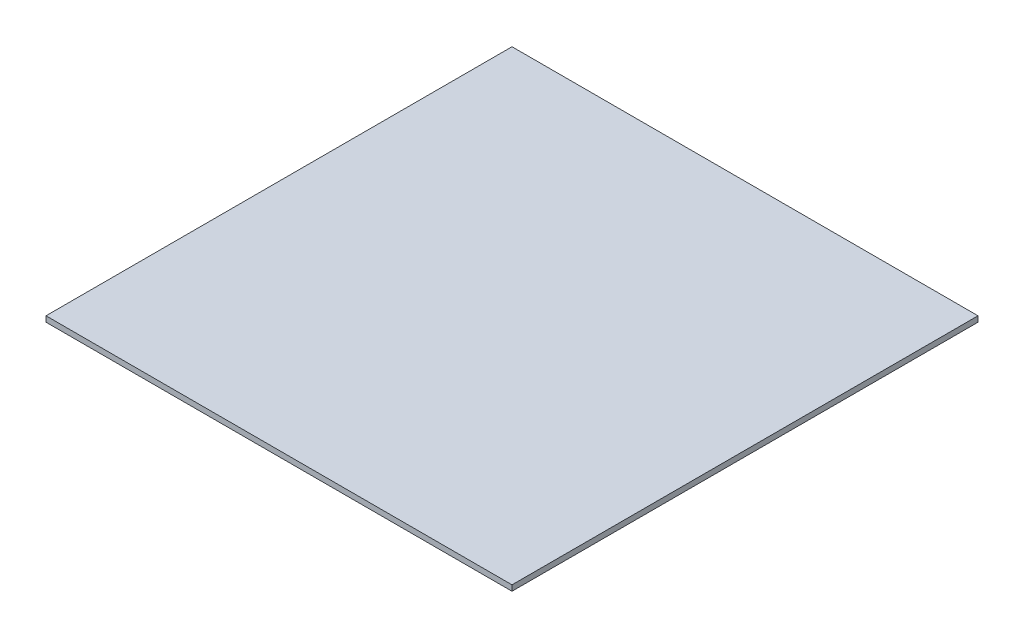
ISO-10303-21;
HEADER;
FILE_DESCRIPTION(('STEP AP214'),'2;1');
FILE_NAME('part.step','',(''),(''),'','','');
FILE_SCHEMA(('AUTOMOTIVE_DESIGN { 1 0 10303 214 1 1 1 1 }'));
ENDSEC;
DATA;
#1=APPLICATION_CONTEXT('core data for automotive mechanical design processes');
#2=APPLICATION_PROTOCOL_DEFINITION('international standard','automotive_design',2000,#1);
#3=PRODUCT_CONTEXT('',#1,'mechanical');
#4=PRODUCT('Part','Part','',(#3));
#5=PRODUCT_RELATED_PRODUCT_CATEGORY('part','',(#4));
#6=PRODUCT_DEFINITION_FORMATION('','',#4);
#7=PRODUCT_DEFINITION_CONTEXT('part definition',#1,'design');
#8=PRODUCT_DEFINITION('design','',#6,#7);
#9=PRODUCT_DEFINITION_SHAPE('','',#8);
#10=(LENGTH_UNIT() NAMED_UNIT(*) SI_UNIT(.MILLI.,.METRE.));
#11=(NAMED_UNIT(*) PLANE_ANGLE_UNIT() SI_UNIT($,.RADIAN.));
#12=(NAMED_UNIT(*) SI_UNIT($,.STERADIAN.) SOLID_ANGLE_UNIT());
#13=UNCERTAINTY_MEASURE_WITH_UNIT(LENGTH_MEASURE(1.E-05),#10,'distance_accuracy_value','');
#14=(GEOMETRIC_REPRESENTATION_CONTEXT(3) GLOBAL_UNCERTAINTY_ASSIGNED_CONTEXT((#13)) GLOBAL_UNIT_ASSIGNED_CONTEXT((#10,
#11,#12)) REPRESENTATION_CONTEXT('',''));
#15=CARTESIAN_POINT('',(0.,0.,0.));
#16=DIRECTION('',(0.,0.,1.));
#17=DIRECTION('',(1.,0.,0.));
#18=AXIS2_PLACEMENT_3D('',#15,#16,#17);
#19=CARTESIAN_POINT('',(125.,1.5,125.));
#20=DIRECTION('',(-1.,0.,0.));
#21=DIRECTION('',(0.,0.,1.));
#22=AXIS2_PLACEMENT_3D('',#19,#20,#21);
#23=PLANE('',#22);
#24=DIRECTION('',(0.,0.,-1.));
#25=VECTOR('',#24,1.);
#26=CARTESIAN_POINT('',(125.,-1.5,125.));
#27=LINE('',#26,#25);
#28=CARTESIAN_POINT('',(125.,-1.5,125.));
#29=VERTEX_POINT('',#28);
#30=CARTESIAN_POINT('',(125.,-1.5,-125.));
#31=VERTEX_POINT('',#30);
#32=EDGE_CURVE('E107',#29,#31,#27,.T.);
#33=ORIENTED_EDGE('',*,*,#32,.T.);
#34=DIRECTION('',(0.,-1.,0.));
#35=VECTOR('',#34,1.);
#36=CARTESIAN_POINT('',(125.,1.5,-125.));
#37=LINE('',#36,#35);
#38=CARTESIAN_POINT('',(125.,1.5,-125.));
#39=VERTEX_POINT('',#38);
#40=EDGE_CURVE('E11',#39,#31,#37,.T.);
#41=ORIENTED_EDGE('',*,*,#40,.F.);
#42=DIRECTION('',(0.,0.,-1.));
#43=VECTOR('',#42,1.);
#44=CARTESIAN_POINT('',(125.,1.5,125.));
#45=LINE('',#44,#43);
#46=CARTESIAN_POINT('',(125.,1.5,125.));
#47=VERTEX_POINT('',#46);
#48=EDGE_CURVE('E91',#47,#39,#45,.T.);
#49=ORIENTED_EDGE('',*,*,#48,.F.);
#50=DIRECTION('',(0.,-1.,0.));
#51=VECTOR('',#50,1.);
#52=CARTESIAN_POINT('',(125.,1.5,125.));
#53=LINE('',#52,#51);
#54=EDGE_CURVE('E103',#47,#29,#53,.T.);
#55=ORIENTED_EDGE('',*,*,#54,.T.);
#56=EDGE_LOOP('',(#33,#41,#49,#55));
#57=FACE_BOUND('',#56,.T.);
#58=ADVANCED_FACE('F39',(#57),#23,.F.);
#59=CARTESIAN_POINT('',(-125.,1.5,-125.));
#60=DIRECTION('',(0.,0.,1.));
#61=DIRECTION('',(1.,0.,0.));
#62=AXIS2_PLACEMENT_3D('',#59,#60,#61);
#63=PLANE('',#62);
#64=DIRECTION('',(-1.,0.,0.));
#65=VECTOR('',#64,1.);
#66=CARTESIAN_POINT('',(-125.,-1.5,-125.));
#67=LINE('',#66,#65);
#68=CARTESIAN_POINT('',(-125.,-1.5,-125.));
#69=VERTEX_POINT('',#68);
#70=EDGE_CURVE('E96',#31,#69,#67,.T.);
#71=ORIENTED_EDGE('',*,*,#70,.T.);
#72=DIRECTION('',(0.,-1.,0.));
#73=VECTOR('',#72,1.);
#74=CARTESIAN_POINT('',(-125.,1.5,-125.));
#75=LINE('',#74,#73);
#76=CARTESIAN_POINT('',(-125.,1.5,-125.));
#77=VERTEX_POINT('',#76);
#78=EDGE_CURVE('E48',#77,#69,#75,.T.);
#79=ORIENTED_EDGE('',*,*,#78,.F.);
#80=DIRECTION('',(-1.,0.,0.));
#81=VECTOR('',#80,1.);
#82=CARTESIAN_POINT('',(-125.,1.5,-125.));
#83=LINE('',#82,#81);
#84=EDGE_CURVE('E86',#39,#77,#83,.T.);
#85=ORIENTED_EDGE('',*,*,#84,.F.);
#86=ORIENTED_EDGE('',*,*,#40,.T.);
#87=EDGE_LOOP('',(#71,#79,#85,#86));
#88=FACE_BOUND('',#87,.T.);
#89=ADVANCED_FACE('F95',(#88),#63,.F.);
#90=CARTESIAN_POINT('',(-125.,1.5,125.));
#91=DIRECTION('',(1.,0.,0.));
#92=DIRECTION('',(0.,0.,-1.));
#93=AXIS2_PLACEMENT_3D('',#90,#91,#92);
#94=PLANE('',#93);
#95=DIRECTION('',(0.,0.,1.));
#96=VECTOR('',#95,1.);
#97=CARTESIAN_POINT('',(-125.,-1.5,125.));
#98=LINE('',#97,#96);
#99=CARTESIAN_POINT('',(-125.,-1.5,125.));
#100=VERTEX_POINT('',#99);
#101=EDGE_CURVE('E73',#69,#100,#98,.T.);
#102=ORIENTED_EDGE('',*,*,#101,.T.);
#103=DIRECTION('',(0.,-1.,0.));
#104=VECTOR('',#103,1.);
#105=CARTESIAN_POINT('',(-125.,1.5,125.));
#106=LINE('',#105,#104);
#107=CARTESIAN_POINT('',(-125.,1.5,125.));
#108=VERTEX_POINT('',#107);
#109=EDGE_CURVE('E98',#108,#100,#106,.T.);
#110=ORIENTED_EDGE('',*,*,#109,.F.);
#111=DIRECTION('',(0.,0.,1.));
#112=VECTOR('',#111,1.);
#113=CARTESIAN_POINT('',(-125.,1.5,125.));
#114=LINE('',#113,#112);
#115=EDGE_CURVE('E89',#77,#108,#114,.T.);
#116=ORIENTED_EDGE('',*,*,#115,.F.);
#117=ORIENTED_EDGE('',*,*,#78,.T.);
#118=EDGE_LOOP('',(#102,#110,#116,#117));
#119=FACE_BOUND('',#118,.T.);
#120=ADVANCED_FACE('F99',(#119),#94,.F.);
#121=CARTESIAN_POINT('',(-125.,1.5,125.));
#122=DIRECTION('',(0.,0.,-1.));
#123=DIRECTION('',(-1.,0.,0.));
#124=AXIS2_PLACEMENT_3D('',#121,#122,#123);
#125=PLANE('',#124);
#126=DIRECTION('',(1.,0.,0.));
#127=VECTOR('',#126,1.);
#128=CARTESIAN_POINT('',(-125.,-1.5,125.));
#129=LINE('',#128,#127);
#130=EDGE_CURVE('E79',#100,#29,#129,.T.);
#131=ORIENTED_EDGE('',*,*,#130,.T.);
#132=ORIENTED_EDGE('',*,*,#54,.F.);
#133=DIRECTION('',(1.,0.,0.));
#134=VECTOR('',#133,1.);
#135=CARTESIAN_POINT('',(-125.,1.5,125.));
#136=LINE('',#135,#134);
#137=EDGE_CURVE('E56',#108,#47,#136,.T.);
#138=ORIENTED_EDGE('',*,*,#137,.F.);
#139=ORIENTED_EDGE('',*,*,#109,.T.);
#140=EDGE_LOOP('',(#131,#132,#138,#139));
#141=FACE_BOUND('',#140,.T.);
#142=ADVANCED_FACE('F120',(#141),#125,.F.);
#143=CARTESIAN_POINT('',(0.,1.5,0.));
#144=DIRECTION('',(0.,-1.,0.));
#145=DIRECTION('',(0.,0.,-1.));
#146=AXIS2_PLACEMENT_3D('',#143,#144,#145);
#147=PLANE('',#146);
#148=ORIENTED_EDGE('',*,*,#48,.T.);
#149=ORIENTED_EDGE('',*,*,#84,.T.);
#150=ORIENTED_EDGE('',*,*,#115,.T.);
#151=ORIENTED_EDGE('',*,*,#137,.T.);
#152=EDGE_LOOP('',(#148,#149,#150,#151));
#153=FACE_BOUND('',#152,.T.);
#154=ADVANCED_FACE('F87',(#153),#147,.F.);
#155=CARTESIAN_POINT('',(0.,-1.5,0.));
#156=DIRECTION('',(0.,-1.,0.));
#157=DIRECTION('',(0.,0.,-1.));
#158=AXIS2_PLACEMENT_3D('',#155,#156,#157);
#159=PLANE('',#158);
#160=ORIENTED_EDGE('',*,*,#32,.F.);
#161=ORIENTED_EDGE('',*,*,#130,.F.);
#162=ORIENTED_EDGE('',*,*,#101,.F.);
#163=ORIENTED_EDGE('',*,*,#70,.F.);
#164=EDGE_LOOP('',(#160,#161,#162,#163));
#165=FACE_BOUND('',#164,.T.);
#166=ADVANCED_FACE('F123',(#165),#159,.T.);
#167=CLOSED_SHELL('',(#58,#89,#120,#142,#154,#166));
#168=MANIFOLD_SOLID_BREP('B2',#167);
#169=ADVANCED_BREP_SHAPE_REPRESENTATION('',(#18,#168),#14);
#170=SHAPE_DEFINITION_REPRESENTATION(#9,#169);
ENDSEC;
END-ISO-10303-21;
